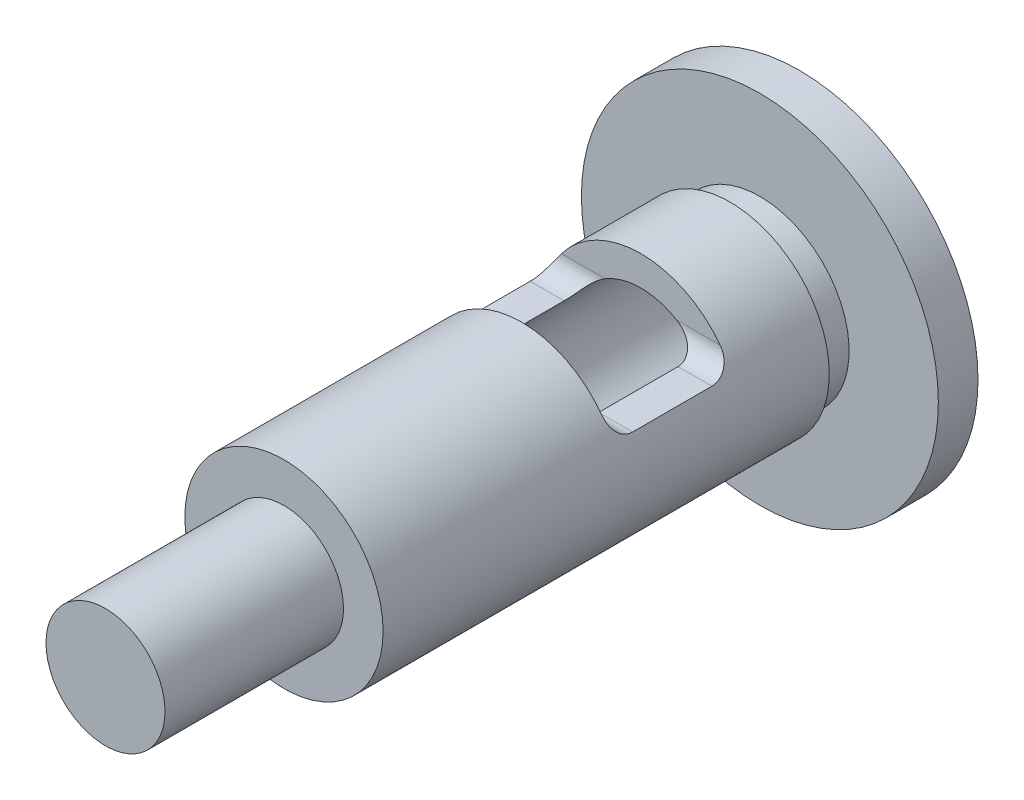
ISO-10303-21;
HEADER;
FILE_DESCRIPTION(('STEP AP214'),'2;1');
FILE_NAME('part.step','',(''),(''),'','','');
FILE_SCHEMA(('AUTOMOTIVE_DESIGN { 1 0 10303 214 1 1 1 1 }'));
ENDSEC;
DATA;
#1=APPLICATION_CONTEXT('core data for automotive mechanical design processes');
#2=APPLICATION_PROTOCOL_DEFINITION('international standard','automotive_design',2000,#1);
#3=PRODUCT_CONTEXT('',#1,'mechanical');
#4=PRODUCT('Part','Part','',(#3));
#5=PRODUCT_RELATED_PRODUCT_CATEGORY('part','',(#4));
#6=PRODUCT_DEFINITION_FORMATION('','',#4);
#7=PRODUCT_DEFINITION_CONTEXT('part definition',#1,'design');
#8=PRODUCT_DEFINITION('design','',#6,#7);
#9=PRODUCT_DEFINITION_SHAPE('','',#8);
#10=(LENGTH_UNIT() NAMED_UNIT(*) SI_UNIT(.MILLI.,.METRE.));
#11=(NAMED_UNIT(*) PLANE_ANGLE_UNIT() SI_UNIT($,.RADIAN.));
#12=(NAMED_UNIT(*) SI_UNIT($,.STERADIAN.) SOLID_ANGLE_UNIT());
#13=UNCERTAINTY_MEASURE_WITH_UNIT(LENGTH_MEASURE(1.E-05),#10,'distance_accuracy_value','');
#14=(GEOMETRIC_REPRESENTATION_CONTEXT(3) GLOBAL_UNCERTAINTY_ASSIGNED_CONTEXT((#13)) GLOBAL_UNIT_ASSIGNED_CONTEXT((#10,
#11,#12)) REPRESENTATION_CONTEXT('',''));
#15=CARTESIAN_POINT('',(0.,0.,0.));
#16=DIRECTION('',(0.,0.,1.));
#17=DIRECTION('',(1.,0.,0.));
#18=AXIS2_PLACEMENT_3D('',#15,#16,#17);
#19=CARTESIAN_POINT('',(0.,0.,0.));
#20=DIRECTION('',(0.,0.,-1.));
#21=DIRECTION('',(-1.,0.,0.));
#22=AXIS2_PLACEMENT_3D('',#19,#20,#21);
#23=CYLINDRICAL_SURFACE('',#22,10.);
#24=CARTESIAN_POINT('',(0.,0.,52.));
#25=DIRECTION('',(0.,0.,-1.));
#26=DIRECTION('',(-1.,0.,0.));
#27=AXIS2_PLACEMENT_3D('',#24,#25,#26);
#28=CIRCLE('',#27,10.);
#29=CARTESIAN_POINT('',(-10.,0.,52.));
#30=VERTEX_POINT('',#29);
#31=EDGE_CURVE('E249',#30,#30,#28,.T.);
#32=ORIENTED_EDGE('',*,*,#31,.T.);
#33=EDGE_LOOP('',(#32));
#34=FACE_BOUND('',#33,.T.);
#35=CARTESIAN_POINT('',(0.,0.,7.));
#36=DIRECTION('',(0.,0.,-1.));
#37=DIRECTION('',(-1.,0.,0.));
#38=AXIS2_PLACEMENT_3D('',#35,#36,#37);
#39=CIRCLE('',#38,10.);
#40=CARTESIAN_POINT('',(-10.,0.,7.));
#41=VERTEX_POINT('',#40);
#42=EDGE_CURVE('E254',#41,#41,#39,.T.);
#43=ORIENTED_EDGE('',*,*,#42,.F.);
#44=EDGE_LOOP('',(#43));
#45=FACE_BOUND('',#44,.T.);
#46=CARTESIAN_POINT('',(0.,0.,28.));
#47=DIRECTION('',(0.,0.,-1.));
#48=DIRECTION('',(-1.,0.,0.));
#49=AXIS2_PLACEMENT_3D('',#46,#47,#48);
#50=CIRCLE('',#49,10.);
#51=CARTESIAN_POINT('',(7.99999999999999,6.00000000000001,28.));
#52=VERTEX_POINT('',#51);
#53=CARTESIAN_POINT('',(-7.99999999999999,6.00000000000001,28.));
#54=VERTEX_POINT('',#53);
#55=EDGE_CURVE('E238',#52,#54,#50,.F.);
#56=ORIENTED_EDGE('',*,*,#55,.T.);
#57=CARTESIAN_POINT('',(-7.99999999999999,6.00000000000001,28.));
#58=CARTESIAN_POINT('',(-8.05100860734724,5.93200968711192,28.0000006017743));
#59=CARTESIAN_POINT('',(-8.10115365222653,5.8633227757035,27.9965312715209));
#60=CARTESIAN_POINT('',(-8.19942377317648,5.72508416287429,27.9822362732475));
#61=CARTESIAN_POINT('',(-8.24754486313818,5.65553107530453,27.9713967498904));
#62=CARTESIAN_POINT('',(-8.34147945854254,5.51605217330794,27.9418788272164));
#63=CARTESIAN_POINT('',(-8.38728221352921,5.44612603709733,27.9231670974573));
#64=CARTESIAN_POINT('',(-8.47590454553098,5.30714938590851,27.8775799116504));
#65=CARTESIAN_POINT('',(-8.51872679892919,5.23809813211877,27.8507118990157));
#66=CARTESIAN_POINT('',(-8.6187034931901,5.07255731362541,27.7751856070284));
#67=CARTESIAN_POINT('',(-8.67414266859352,4.97698045814653,27.7221231604303));
#68=CARTESIAN_POINT('',(-8.77699348164833,4.79327271198358,27.598754611255));
#69=CARTESIAN_POINT('',(-8.82442593485662,4.7051228217874,27.5284944227016));
#70=CARTESIAN_POINT('',(-8.91083720028691,4.53935888130144,27.371008855693));
#71=CARTESIAN_POINT('',(-8.94976464838187,4.46180985101524,27.2836861210925));
#72=CARTESIAN_POINT('',(-9.0182142913682,4.32179606710732,27.0942981292375));
#73=CARTESIAN_POINT('',(-9.04773146024579,4.25933937857461,26.9922250359942));
#74=CARTESIAN_POINT('',(-9.09466953671398,4.15810169516961,26.786931105403));
#75=CARTESIAN_POINT('',(-9.11297222672082,4.11763694664433,26.6847374467985));
#76=CARTESIAN_POINT('',(-9.14149760740605,4.05391926931878,26.4741492396114));
#77=CARTESIAN_POINT('',(-9.15173523125053,4.03063453533525,26.3657665516932));
#78=CARTESIAN_POINT('',(-9.16035163835097,4.01098253148704,26.2136724930338));
#79=CARTESIAN_POINT('',(-9.16215309604838,4.00686409758567,26.1710259909114));
#80=CARTESIAN_POINT('',(-9.16455116975046,4.0013760840502,26.0855935236979));
#81=CARTESIAN_POINT('',(-9.16514977186681,4.00000197311215,26.0428079055335));
#82=CARTESIAN_POINT('',(-9.16515138991168,4.,26.));
#83=B_SPLINE_CURVE_WITH_KNOTS('',3,(#57,#58,#59,#60,#61,#62,#63,#64,#65,#66,#67,#68,#69,#70,#71,
#72,#73,#74,#75,#76,#77,#78,#79,#80,#81,#82),.UNSPECIFIED.,.F.,.F.,(4,2,2,2,2,2,2,2,2,2,2,2,4),
(0.,0.254972115430075,0.51042488690115,0.766970291028312,1.02328227241889,1.38935419811024,
1.75445925631581,2.12171181168203,2.48916018866137,2.82175586610571,3.15373425696247,
3.28229982324812,3.41065293170572),.UNSPECIFIED.);
#84=CARTESIAN_POINT('',(-9.16515138991168,4.,26.));
#85=VERTEX_POINT('',#84);
#86=EDGE_CURVE('E191',#54,#85,#83,.T.);
#87=ORIENTED_EDGE('',*,*,#86,.T.);
#88=DIRECTION('',(0.,0.,-1.));
#89=VECTOR('',#88,1.);
#90=CARTESIAN_POINT('',(-9.16515138991168,4.,0.));
#91=LINE('',#90,#89);
#92=CARTESIAN_POINT('',(-9.16515138991168,4.,18.));
#93=VERTEX_POINT('',#92);
#94=EDGE_CURVE('E240',#85,#93,#91,.T.);
#95=ORIENTED_EDGE('',*,*,#94,.T.);
#96=CARTESIAN_POINT('',(-9.16515138991168,4.,18.));
#97=CARTESIAN_POINT('',(-9.16515117183312,3.99999264234156,17.9476691734351));
#98=CARTESIAN_POINT('',(-9.16425496664045,4.00205376138436,17.8953414927471));
#99=CARTESIAN_POINT('',(-9.16067005739489,4.01025694582917,17.7910758126955));
#100=CARTESIAN_POINT('',(-9.15798160024527,4.01639844911104,17.7391377606527));
#101=CARTESIAN_POINT('',(-9.15081977291224,4.03268797715261,17.636136744279));
#102=CARTESIAN_POINT('',(-9.14635045442331,4.04282690669225,17.5850720660826));
#103=CARTESIAN_POINT('',(-9.13563109883409,4.06699124711838,17.4840760640679));
#104=CARTESIAN_POINT('',(-9.12938105685553,4.0810166686519,17.4341447433549));
#105=CARTESIAN_POINT('',(-9.10795685357301,4.12872306426808,17.2865715998994));
#106=CARTESIAN_POINT('',(-9.09010262629202,4.16804823069825,17.1910631409174));
#107=CARTESIAN_POINT('',(-9.04734503409114,4.26005905139115,17.0084973511718));
#108=CARTESIAN_POINT('',(-9.0224400642028,4.31274774732447,16.9214419506537));
#109=CARTESIAN_POINT('',(-8.96516926076699,4.43058754304288,16.7560294596436));
#110=CARTESIAN_POINT('',(-8.93265886592638,4.49597530571395,16.6778912457653));
#111=CARTESIAN_POINT('',(-8.86085839472232,4.63587792882915,16.5339670559478));
#112=CARTESIAN_POINT('',(-8.82156905089418,4.7103918028507,16.4681797469683));
#113=CARTESIAN_POINT('',(-8.7337050665276,4.8714862628894,16.3454847069902));
#114=CARTESIAN_POINT('',(-8.68466859165629,4.95854821418175,16.2895421936174));
#115=CARTESIAN_POINT('',(-8.58017049651171,5.13725940054471,16.1927808080525));
#116=CARTESIAN_POINT('',(-8.52469686398252,5.22891702453962,16.1519908272592));
#117=CARTESIAN_POINT('',(-8.39548924689344,5.43447129881107,16.0778725937928));
#118=CARTESIAN_POINT('',(-8.32041851960717,5.54883725751874,16.0481419193314));
#119=CARTESIAN_POINT('',(-8.2032821451696,5.7193485046504,16.0189494574638));
#120=CARTESIAN_POINT('',(-8.16353999327878,5.77593472661013,16.0117852073056));
#121=CARTESIAN_POINT('',(-8.08272919797198,5.88848713541995,16.002316231558));
#122=CARTESIAN_POINT('',(-8.04166182979912,5.9444538526182,16.0000069677809));
#123=CARTESIAN_POINT('',(-7.99999999999999,6.00000000000001,16.));
#124=B_SPLINE_CURVE_WITH_KNOTS('',3,(#96,#97,#98,#99,#100,#101,#102,#103,#104,#105,#106,#107,
#108,#109,#110,#111,#112,#113,#114,#115,#116,#117,#118,#119,#120,#121,#122,#123),.UNSPECIFIED.,
.F.,.F.,(4,2,2,2,2,2,2,2,2,2,2,2,2,4),(0.,0.156938762205109,0.313855908760739,0.470418068100069,
0.62698065634509,0.939842867153021,1.25277635247853,1.57222617149183,1.89164149225455,
2.23379020068857,2.57658797718782,2.99455494394361,3.2029600514477,3.41117026596516),.UNSPECIFIED.);
#125=CARTESIAN_POINT('',(-7.99999999999999,6.00000000000001,16.));
#126=VERTEX_POINT('',#125);
#127=EDGE_CURVE('E162',#93,#126,#124,.T.);
#128=ORIENTED_EDGE('',*,*,#127,.T.);
#129=CARTESIAN_POINT('',(0.,0.,16.));
#130=DIRECTION('',(0.,0.,1.));
#131=DIRECTION('',(1.,0.,0.));
#132=AXIS2_PLACEMENT_3D('',#129,#130,#131);
#133=CIRCLE('',#132,10.);
#134=CARTESIAN_POINT('',(7.99999999999999,6.00000000000001,16.));
#135=VERTEX_POINT('',#134);
#136=EDGE_CURVE('E224',#126,#135,#133,.F.);
#137=ORIENTED_EDGE('',*,*,#136,.T.);
#138=CARTESIAN_POINT('',(7.99999999999999,6.00000000000001,16.));
#139=CARTESIAN_POINT('',(8.05100860734724,5.93200968711192,15.9999993982257));
#140=CARTESIAN_POINT('',(8.10115365222653,5.8633227757035,16.0034687284791));
#141=CARTESIAN_POINT('',(8.19942377317648,5.72508416287429,16.0177637267525));
#142=CARTESIAN_POINT('',(8.24754486313818,5.65553107530453,16.0286032501096));
#143=CARTESIAN_POINT('',(8.34147945854254,5.51605217330794,16.0581211727836));
#144=CARTESIAN_POINT('',(8.38728221352921,5.44612603709733,16.0768329025427));
#145=CARTESIAN_POINT('',(8.47590454553098,5.30714938590851,16.1224200883496));
#146=CARTESIAN_POINT('',(8.51872679892919,5.23809813211877,16.1492881009843));
#147=CARTESIAN_POINT('',(8.6187034931901,5.07255731362541,16.2248143929716));
#148=CARTESIAN_POINT('',(8.67414266859352,4.97698045814653,16.2778768395697));
#149=CARTESIAN_POINT('',(8.77699348164833,4.79327271198358,16.401245388745));
#150=CARTESIAN_POINT('',(8.82442593485662,4.7051228217874,16.4715055772984));
#151=CARTESIAN_POINT('',(8.91083720028691,4.53935888130144,16.628991144307));
#152=CARTESIAN_POINT('',(8.94976464838187,4.46180985101525,16.7163138789075));
#153=CARTESIAN_POINT('',(9.0182142913682,4.32179606710732,16.9057018707625));
#154=CARTESIAN_POINT('',(9.04773146024579,4.25933937857461,17.0077749640058));
#155=CARTESIAN_POINT('',(9.09466953671398,4.15810169516961,17.213068894597));
#156=CARTESIAN_POINT('',(9.11297222672082,4.11763694664432,17.3152625532015));
#157=CARTESIAN_POINT('',(9.14149760740605,4.05391926931878,17.5258507603886));
#158=CARTESIAN_POINT('',(9.15173523125053,4.03063453533525,17.6342334483068));
#159=CARTESIAN_POINT('',(9.16035163835097,4.01098253148704,17.7863275069662));
#160=CARTESIAN_POINT('',(9.16215309604838,4.00686409758567,17.8289740090886));
#161=CARTESIAN_POINT('',(9.16455116975046,4.0013760840502,17.9144064763021));
#162=CARTESIAN_POINT('',(9.16514977186681,4.00000197311215,17.9571920944665));
#163=CARTESIAN_POINT('',(9.16515138991168,4.,18.));
#164=B_SPLINE_CURVE_WITH_KNOTS('',3,(#138,#139,#140,#141,#142,#143,#144,#145,#146,#147,#148,
#149,#150,#151,#152,#153,#154,#155,#156,#157,#158,#159,#160,#161,#162,#163),.UNSPECIFIED.,.F.,
.F.,(4,2,2,2,2,2,2,2,2,2,2,2,4),(0.,0.254972115430075,0.51042488690115,0.766970291028312,
1.02328227241889,1.38935419811024,1.75445925631581,2.12171181168202,2.48916018866137,
2.82175586610572,3.15373425696247,3.28229982324812,3.41065293170572),.UNSPECIFIED.);
#165=CARTESIAN_POINT('',(9.16515138991168,4.,18.));
#166=VERTEX_POINT('',#165);
#167=EDGE_CURVE('E155',#135,#166,#164,.T.);
#168=ORIENTED_EDGE('',*,*,#167,.T.);
#169=DIRECTION('',(0.,0.,-1.));
#170=VECTOR('',#169,1.);
#171=CARTESIAN_POINT('',(9.16515138991168,4.,0.));
#172=LINE('',#171,#170);
#173=CARTESIAN_POINT('',(9.16515138991168,4.,26.));
#174=VERTEX_POINT('',#173);
#175=EDGE_CURVE('E121',#166,#174,#172,.F.);
#176=ORIENTED_EDGE('',*,*,#175,.T.);
#177=CARTESIAN_POINT('',(9.16515138991168,4.,26.));
#178=CARTESIAN_POINT('',(9.16515117183312,3.99999264234156,26.0523308265649));
#179=CARTESIAN_POINT('',(9.16425496664045,4.00205376138436,26.1046585072529));
#180=CARTESIAN_POINT('',(9.16067005739489,4.01025694582917,26.2089241873045));
#181=CARTESIAN_POINT('',(9.15798160024527,4.01639844911103,26.2608622393473));
#182=CARTESIAN_POINT('',(9.15081977291224,4.03268797715261,26.363863255721));
#183=CARTESIAN_POINT('',(9.14635045442331,4.04282690669225,26.4149279339174));
#184=CARTESIAN_POINT('',(9.1356310988341,4.06699124711838,26.5159239359321));
#185=CARTESIAN_POINT('',(9.12938105685553,4.0810166686519,26.5658552566451));
#186=CARTESIAN_POINT('',(9.10795685357301,4.12872306426808,26.7134284001006));
#187=CARTESIAN_POINT('',(9.09010262629202,4.16804823069825,26.8089368590826));
#188=CARTESIAN_POINT('',(9.04734503409114,4.26005905139115,26.9915026488282));
#189=CARTESIAN_POINT('',(9.0224400642028,4.31274774732447,27.0785580493463));
#190=CARTESIAN_POINT('',(8.96516926076699,4.43058754304288,27.2439705403564));
#191=CARTESIAN_POINT('',(8.93265886592638,4.49597530571395,27.3221087542347));
#192=CARTESIAN_POINT('',(8.86085839472232,4.63587792882915,27.4660329440522));
#193=CARTESIAN_POINT('',(8.82156905089418,4.7103918028507,27.5318202530317));
#194=CARTESIAN_POINT('',(8.7337050665276,4.8714862628894,27.6545152930098));
#195=CARTESIAN_POINT('',(8.68466859165629,4.95854821418175,27.7104578063826));
#196=CARTESIAN_POINT('',(8.58017049651171,5.13725940054471,27.8072191919475));
#197=CARTESIAN_POINT('',(8.52469686398252,5.22891702453962,27.8480091727408));
#198=CARTESIAN_POINT('',(8.39548924689344,5.43447129881107,27.9221274062072));
#199=CARTESIAN_POINT('',(8.32041851960717,5.54883725751874,27.9518580806686));
#200=CARTESIAN_POINT('',(8.2032821451696,5.7193485046504,27.9810505425362));
#201=CARTESIAN_POINT('',(8.16353999327878,5.77593472661013,27.9882147926944));
#202=CARTESIAN_POINT('',(8.08272919797198,5.88848713541995,27.997683768442));
#203=CARTESIAN_POINT('',(8.04166182979912,5.9444538526182,27.9999930322191));
#204=CARTESIAN_POINT('',(7.99999999999999,6.00000000000001,28.));
#205=B_SPLINE_CURVE_WITH_KNOTS('',3,(#177,#178,#179,#180,#181,#182,#183,#184,#185,#186,#187,
#188,#189,#190,#191,#192,#193,#194,#195,#196,#197,#198,#199,#200,#201,#202,#203,#204),
.UNSPECIFIED.,.F.,.F.,(4,2,2,2,2,2,2,2,2,2,2,2,2,4),(0.,0.156938762205106,0.313855908760735,
0.470418068100069,0.62698065634509,0.939842867153017,1.25277635247853,1.57222617149183,
1.89164149225455,2.23379020068857,2.57658797718782,2.99455494394361,3.2029600514477,
3.41117026596516),.UNSPECIFIED.);
#206=EDGE_CURVE('E184',#174,#52,#205,.T.);
#207=ORIENTED_EDGE('',*,*,#206,.T.);
#208=EDGE_LOOP('',(#56,#87,#95,#128,#137,#168,#176,#207));
#209=FACE_BOUND('',#208,.T.);
#210=ADVANCED_FACE('F33',(#34,#45,#209),#23,.T.);
#211=CARTESIAN_POINT('',(0.,0.,0.));
#212=DIRECTION('',(0.,0.,-1.));
#213=DIRECTION('',(-1.,0.,0.));
#214=AXIS2_PLACEMENT_3D('',#211,#212,#213);
#215=CYLINDRICAL_SURFACE('',#214,7.);
#216=CARTESIAN_POINT('',(0.,0.,0.));
#217=DIRECTION('',(0.,0.,-1.));
#218=DIRECTION('',(-1.,0.,0.));
#219=AXIS2_PLACEMENT_3D('',#216,#217,#218);
#220=CIRCLE('',#219,7.);
#221=CARTESIAN_POINT('',(-7.,0.,0.));
#222=VERTEX_POINT('',#221);
#223=EDGE_CURVE('E269',#222,#222,#220,.T.);
#224=ORIENTED_EDGE('',*,*,#223,.T.);
#225=EDGE_LOOP('',(#224));
#226=FACE_BOUND('',#225,.T.);
#227=CARTESIAN_POINT('',(0.,0.,32.));
#228=DIRECTION('',(0.,0.,-1.));
#229=DIRECTION('',(-1.,0.,0.));
#230=AXIS2_PLACEMENT_3D('',#227,#228,#229);
#231=CIRCLE('',#230,7.);
#232=CARTESIAN_POINT('',(-7.,0.,32.));
#233=VERTEX_POINT('',#232);
#234=EDGE_CURVE('E272',#233,#233,#231,.T.);
#235=ORIENTED_EDGE('',*,*,#234,.F.);
#236=EDGE_LOOP('',(#235));
#237=FACE_BOUND('',#236,.T.);
#238=CARTESIAN_POINT('',(0.,0.,28.));
#239=DIRECTION('',(0.,0.,-1.));
#240=DIRECTION('',(-1.,0.,0.));
#241=AXIS2_PLACEMENT_3D('',#238,#239,#240);
#242=CIRCLE('',#241,7.);
#243=CARTESIAN_POINT('',(-3.60555127546397,6.00000000000001,28.));
#244=VERTEX_POINT('',#243);
#245=CARTESIAN_POINT('',(3.60555127546397,6.00000000000001,28.));
#246=VERTEX_POINT('',#245);
#247=EDGE_CURVE('E215',#244,#246,#242,.T.);
#248=ORIENTED_EDGE('',*,*,#247,.T.);
#249=CARTESIAN_POINT('',(3.60555127546397,6.00000000000001,28.));
#250=CARTESIAN_POINT('',(3.70755190220597,5.93873299354331,27.9999691426322));
#251=CARTESIAN_POINT('',(3.8080513779399,5.87477355515046,27.9971788706329));
#252=CARTESIAN_POINT('',(4.00576923521182,5.74177528480111,27.984399412456));
#253=CARTESIAN_POINT('',(4.10297158250474,5.67271572056948,27.9743792060938));
#254=CARTESIAN_POINT('',(4.29414987915284,5.52944271837615,27.9452444235261));
#255=CARTESIAN_POINT('',(4.38806796688927,5.45517424905926,27.9260140962841));
#256=CARTESIAN_POINT('',(4.57011586626603,5.30358694827469,27.8765279801898));
#257=CARTESIAN_POINT('',(4.65825684964816,5.22627449658854,27.8462942594199));
#258=CARTESIAN_POINT('',(4.83398512361372,5.06437226026307,27.7700783510154));
#259=CARTESIAN_POINT('',(4.92104588946857,4.97966820381642,27.7230939442019));
#260=CARTESIAN_POINT('',(5.08498320917748,4.81213356476993,27.6121512784971));
#261=CARTESIAN_POINT('',(5.16189781072966,4.72929700828367,27.5482593003486));
#262=CARTESIAN_POINT('',(5.30469883781685,4.56857133575475,27.4010600725461));
#263=CARTESIAN_POINT('',(5.37043950048018,4.49075478431506,27.3175257829649));
#264=CARTESIAN_POINT('',(5.45813578256462,4.38302820321118,27.17850138587));
#265=CARTESIAN_POINT('',(5.48556279890794,4.3485999177601,27.1298372389949));
#266=CARTESIAN_POINT('',(5.53657238950481,4.28346448739372,27.0281733804973));
#267=CARTESIAN_POINT('',(5.56015592373645,4.25275641378256,26.9751747564696));
#268=CARTESIAN_POINT('',(5.60013211213682,4.19993526040025,26.8732524300319));
#269=CARTESIAN_POINT('',(5.61707160908512,4.17722155172676,26.8248524489374));
#270=CARTESIAN_POINT('',(5.64787993354286,4.13547155849595,26.7255564975638));
#271=CARTESIAN_POINT('',(5.66174936936746,4.11643454551777,26.6746610241979));
#272=CARTESIAN_POINT('',(5.6863169852022,4.08243062040585,26.5708806171931));
#273=CARTESIAN_POINT('',(5.69702022445897,4.0674572182494,26.5179990112638));
#274=CARTESIAN_POINT('',(5.71522127202601,4.04184263000406,26.4106841046948));
#275=CARTESIAN_POINT('',(5.72272079625583,4.03119912495515,26.356251651401));
#276=CARTESIAN_POINT('',(5.73391808908985,4.0152550913869,26.2516172389729));
#277=CARTESIAN_POINT('',(5.73791119956913,4.0095404415909,26.2015094593752));
#278=CARTESIAN_POINT('',(5.74323247250417,4.00191011564273,26.1009360982872));
#279=CARTESIAN_POINT('',(5.74456434639819,3.99998914875317,26.0504711137427));
#280=CARTESIAN_POINT('',(5.74456264653803,4.,26.));
#281=B_SPLINE_CURVE_WITH_KNOTS('',3,(#249,#250,#251,#252,#253,#254,#255,#256,#257,#258,#259,
#260,#261,#262,#263,#264,#265,#266,#267,#268,#269,#270,#271,#272,#273,#274,#275,#276,#277,#278,
#279,#280),.UNSPECIFIED.,.F.,.F.,(4,2,2,2,2,2,2,2,2,2,2,2,2,2,2,4),(0.,0.357039762700281,
0.715620591012604,1.07883121608528,1.4413173750221,1.83070447855544,2.2185871637635,
2.61119513860311,2.80775068768575,3.00425706803094,3.17226499785615,3.34023960800673,
3.50794434443645,3.67555914473391,3.82711916732992,3.97846767194919),.UNSPECIFIED.);
#282=CARTESIAN_POINT('',(5.74456264653803,4.,26.));
#283=VERTEX_POINT('',#282);
#284=EDGE_CURVE('E11',#246,#283,#281,.T.);
#285=ORIENTED_EDGE('',*,*,#284,.T.);
#286=DIRECTION('',(0.,0.,-1.));
#287=VECTOR('',#286,1.);
#288=CARTESIAN_POINT('',(5.74456264653803,4.,0.));
#289=LINE('',#288,#287);
#290=CARTESIAN_POINT('',(5.74456264653803,4.,18.));
#291=VERTEX_POINT('',#290);
#292=EDGE_CURVE('E47',#283,#291,#289,.T.);
#293=ORIENTED_EDGE('',*,*,#292,.T.);
#294=CARTESIAN_POINT('',(5.74456264653803,4.,18.));
#295=CARTESIAN_POINT('',(5.74456395739622,3.9999912690224,17.9521072018173));
#296=CARTESIAN_POINT('',(5.74336481366962,4.00172008399424,17.9042181933505));
#297=CARTESIAN_POINT('',(5.73857681057153,4.00858681048308,17.8088167769062));
#298=CARTESIAN_POINT('',(5.73498853238309,4.01372389290076,17.7613042801819));
#299=CARTESIAN_POINT('',(5.72545090585904,4.02731633277174,17.66717360582));
#300=CARTESIAN_POINT('',(5.71951023510699,4.03575949339295,17.6205527941813));
#301=CARTESIAN_POINT('',(5.70529577654531,4.05582920093227,17.5283766647713));
#302=CARTESIAN_POINT('',(5.69702193925205,4.06745581536741,17.4828213696204));
#303=CARTESIAN_POINT('',(5.66874757903505,4.10686714650466,17.3482705296767));
#304=CARTESIAN_POINT('',(5.64528172342668,4.13920172817476,17.2612663388019));
#305=CARTESIAN_POINT('',(5.58953490597338,4.21417455270277,17.0949163133744));
#306=CARTESIAN_POINT('',(5.55724989312686,4.25681752959233,17.0155740209715));
#307=CARTESIAN_POINT('',(5.48314916105369,4.35187528789755,16.863330727687));
#308=CARTESIAN_POINT('',(5.44103528724802,4.40458369493129,16.7907592212947));
#309=CARTESIAN_POINT('',(5.34882597720006,4.51611660865905,16.6562203333129));
#310=CARTESIAN_POINT('',(5.29872710476222,4.57494374463056,16.5942575409057));
#311=CARTESIAN_POINT('',(5.16947774158055,4.72117045758798,16.4578364756714));
#312=CARTESIAN_POINT('',(5.08683112566817,4.81040666125222,16.3886500077652));
#313=CARTESIAN_POINT('',(4.91008478408788,4.99069901803833,16.2699634531927));
#314=CARTESIAN_POINT('',(4.81596037985182,5.08175872791528,16.2205067982603));
#315=CARTESIAN_POINT('',(4.64678263995698,5.23608484037194,16.1502870282632));
#316=CARTESIAN_POINT('',(4.57389321774731,5.29990809898265,16.1253641327835));
#317=CARTESIAN_POINT('',(4.42420660418333,5.42549164241417,16.0831461624527));
#318=CARTESIAN_POINT('',(4.34740730827438,5.48725078592318,16.0658552451091));
#319=CARTESIAN_POINT('',(4.11207146301771,5.66832478707963,16.0237981156182));
#320=CARTESIAN_POINT('',(3.94850603225306,5.78351968974505,16.0088132102133));
#321=CARTESIAN_POINT('',(3.75149576891142,5.90994718935529,16.0019427559895));
#322=CARTESIAN_POINT('',(3.722460936441,5.92827738436944,16.0012044978374));
#323=CARTESIAN_POINT('',(3.66418008592678,5.96447395625101,16.0002335448968));
#324=CARTESIAN_POINT('',(3.63493464370731,5.98234123127445,15.9999997852162));
#325=CARTESIAN_POINT('',(3.60555127546397,6.00000000000001,16.));
#326=B_SPLINE_CURVE_WITH_KNOTS('',3,(#294,#295,#296,#297,#298,#299,#300,#301,#302,#303,#304,
#305,#306,#307,#308,#309,#310,#311,#312,#313,#314,#315,#316,#317,#318,#319,#320,#321,#322,#323,
#324,#325),.UNSPECIFIED.,.F.,.F.,(4,2,2,2,2,2,2,2,2,2,2,2,2,2,2,4),(0.,0.143625771782519,
0.287216617787313,0.430282643082833,0.573351702863238,0.859117671972935,1.1450151265141,
1.44108176204024,1.73727615004541,2.15474779837939,2.57313343256407,2.87283880763329,
3.17270724582121,3.77206419367062,3.87510243592871,3.97792297214895),.UNSPECIFIED.);
#327=CARTESIAN_POINT('',(3.60555127546397,6.00000000000001,16.));
#328=VERTEX_POINT('',#327);
#329=EDGE_CURVE('E107',#291,#328,#326,.T.);
#330=ORIENTED_EDGE('',*,*,#329,.T.);
#331=CARTESIAN_POINT('',(0.,0.,16.));
#332=DIRECTION('',(0.,0.,1.));
#333=DIRECTION('',(1.,0.,0.));
#334=AXIS2_PLACEMENT_3D('',#331,#332,#333);
#335=CIRCLE('',#334,7.);
#336=CARTESIAN_POINT('',(-3.60555127546397,6.00000000000001,16.));
#337=VERTEX_POINT('',#336);
#338=EDGE_CURVE('E114',#328,#337,#335,.T.);
#339=ORIENTED_EDGE('',*,*,#338,.T.);
#340=CARTESIAN_POINT('',(-3.60555127546397,6.00000000000001,16.));
#341=CARTESIAN_POINT('',(-3.70755190220597,5.93873299354331,16.0000308573678));
#342=CARTESIAN_POINT('',(-3.8080513779399,5.87477355515046,16.0028211293671));
#343=CARTESIAN_POINT('',(-4.00576923521182,5.74177528480111,16.015600587544));
#344=CARTESIAN_POINT('',(-4.10297158250474,5.67271572056948,16.0256207939062));
#345=CARTESIAN_POINT('',(-4.29414987915284,5.52944271837615,16.0547555764739));
#346=CARTESIAN_POINT('',(-4.38806796688927,5.45517424905926,16.0739859037159));
#347=CARTESIAN_POINT('',(-4.57011586626603,5.30358694827469,16.1234720198102));
#348=CARTESIAN_POINT('',(-4.65825684964816,5.22627449658854,16.1537057405801));
#349=CARTESIAN_POINT('',(-4.83398512361372,5.06437226026307,16.2299216489846));
#350=CARTESIAN_POINT('',(-4.92104588946857,4.97966820381642,16.2769060557981));
#351=CARTESIAN_POINT('',(-5.08498320917748,4.81213356476993,16.3878487215029));
#352=CARTESIAN_POINT('',(-5.16189781072966,4.72929700828367,16.4517406996515));
#353=CARTESIAN_POINT('',(-5.30469883781685,4.56857133575475,16.5989399274539));
#354=CARTESIAN_POINT('',(-5.37043950048018,4.49075478431506,16.6824742170351));
#355=CARTESIAN_POINT('',(-5.45813578256462,4.38302820321118,16.82149861413));
#356=CARTESIAN_POINT('',(-5.48556279890794,4.34859991776009,16.8701627610051));
#357=CARTESIAN_POINT('',(-5.53657238950481,4.28346448739372,16.9718266195027));
#358=CARTESIAN_POINT('',(-5.56015592373645,4.25275641378256,17.0248252435304));
#359=CARTESIAN_POINT('',(-5.60013211213683,4.19993526040025,17.1267475699681));
#360=CARTESIAN_POINT('',(-5.61707160908512,4.17722155172676,17.1751475510626));
#361=CARTESIAN_POINT('',(-5.64787993354286,4.13547155849595,17.2744435024362));
#362=CARTESIAN_POINT('',(-5.66174936936746,4.11643454551777,17.3253389758021));
#363=CARTESIAN_POINT('',(-5.6863169852022,4.08243062040585,17.4291193828069));
#364=CARTESIAN_POINT('',(-5.69702022445897,4.0674572182494,17.4820009887362));
#365=CARTESIAN_POINT('',(-5.71522127202601,4.04184263000406,17.5893158953052));
#366=CARTESIAN_POINT('',(-5.72272079625583,4.03119912495515,17.643748348599));
#367=CARTESIAN_POINT('',(-5.73391808908985,4.0152550913869,17.7483827610271));
#368=CARTESIAN_POINT('',(-5.73791119956913,4.0095404415909,17.7984905406248));
#369=CARTESIAN_POINT('',(-5.74323247250417,4.00191011564273,17.8990639017128));
#370=CARTESIAN_POINT('',(-5.74456434639819,3.99998914875317,17.9495288862573));
#371=CARTESIAN_POINT('',(-5.74456264653803,4.,18.));
#372=B_SPLINE_CURVE_WITH_KNOTS('',3,(#340,#341,#342,#343,#344,#345,#346,#347,#348,#349,#350,
#351,#352,#353,#354,#355,#356,#357,#358,#359,#360,#361,#362,#363,#364,#365,#366,#367,#368,#369,
#370,#371),.UNSPECIFIED.,.F.,.F.,(4,2,2,2,2,2,2,2,2,2,2,2,2,2,2,4),(0.,0.357039762700279,
0.715620591012603,1.07883121608528,1.4413173750221,1.83070447855545,2.2185871637635,
2.6111951386031,2.80775068768575,3.00425706803094,3.17226499785615,3.34023960800673,
3.50794434443644,3.67555914473391,3.82711916732992,3.97846767194919),.UNSPECIFIED.);
#373=CARTESIAN_POINT('',(-5.74456264653803,4.,18.));
#374=VERTEX_POINT('',#373);
#375=EDGE_CURVE('E145',#337,#374,#372,.T.);
#376=ORIENTED_EDGE('',*,*,#375,.T.);
#377=DIRECTION('',(0.,0.,-1.));
#378=VECTOR('',#377,1.);
#379=CARTESIAN_POINT('',(-5.74456264653803,4.,0.));
#380=LINE('',#379,#378);
#381=CARTESIAN_POINT('',(-5.74456264653803,4.,26.));
#382=VERTEX_POINT('',#381);
#383=EDGE_CURVE('E216',#374,#382,#380,.F.);
#384=ORIENTED_EDGE('',*,*,#383,.T.);
#385=CARTESIAN_POINT('',(-5.74456264653803,4.,26.));
#386=CARTESIAN_POINT('',(-5.74456395739623,3.9999912690224,26.0478927981827));
#387=CARTESIAN_POINT('',(-5.74336481366962,4.00172008399424,26.0957818066495));
#388=CARTESIAN_POINT('',(-5.73857681057153,4.00858681048308,26.1911832230938));
#389=CARTESIAN_POINT('',(-5.73498853238309,4.01372389290076,26.2386957198181));
#390=CARTESIAN_POINT('',(-5.72545090585904,4.02731633277174,26.33282639418));
#391=CARTESIAN_POINT('',(-5.71951023510699,4.03575949339296,26.3794472058187));
#392=CARTESIAN_POINT('',(-5.70529577654531,4.05582920093227,26.4716233352287));
#393=CARTESIAN_POINT('',(-5.69702193925205,4.06745581536741,26.5171786303796));
#394=CARTESIAN_POINT('',(-5.66874757903505,4.10686714650466,26.6517294703233));
#395=CARTESIAN_POINT('',(-5.64528172342668,4.13920172817476,26.7387336611981));
#396=CARTESIAN_POINT('',(-5.58953490597338,4.21417455270277,26.9050836866256));
#397=CARTESIAN_POINT('',(-5.55724989312686,4.25681752959233,26.9844259790285));
#398=CARTESIAN_POINT('',(-5.48314916105369,4.35187528789755,27.136669272313));
#399=CARTESIAN_POINT('',(-5.44103528724802,4.40458369493129,27.2092407787053));
#400=CARTESIAN_POINT('',(-5.34882597720006,4.51611660865905,27.3437796666871));
#401=CARTESIAN_POINT('',(-5.29872710476222,4.57494374463055,27.4057424590943));
#402=CARTESIAN_POINT('',(-5.16947774158055,4.72117045758798,27.5421635243286));
#403=CARTESIAN_POINT('',(-5.08683112566817,4.81040666125222,27.6113499922348));
#404=CARTESIAN_POINT('',(-4.91008478408789,4.99069901803833,27.7300365468073));
#405=CARTESIAN_POINT('',(-4.81596037985182,5.08175872791528,27.7794932017397));
#406=CARTESIAN_POINT('',(-4.64678263995698,5.23608484037194,27.8497129717368));
#407=CARTESIAN_POINT('',(-4.57389321774731,5.29990809898265,27.8746358672165));
#408=CARTESIAN_POINT('',(-4.42420660418333,5.42549164241417,27.9168538375474));
#409=CARTESIAN_POINT('',(-4.34740730827438,5.48725078592318,27.9341447548909));
#410=CARTESIAN_POINT('',(-4.11207146301771,5.66832478707963,27.9762018843818));
#411=CARTESIAN_POINT('',(-3.94850603225306,5.78351968974505,27.9911867897867));
#412=CARTESIAN_POINT('',(-3.75149576891142,5.90994718935529,27.9980572440105));
#413=CARTESIAN_POINT('',(-3.722460936441,5.92827738436944,27.9987955021626));
#414=CARTESIAN_POINT('',(-3.66418008592678,5.96447395625101,27.9997664551032));
#415=CARTESIAN_POINT('',(-3.63493464370731,5.98234123127445,28.0000002147838));
#416=CARTESIAN_POINT('',(-3.60555127546397,6.00000000000001,28.));
#417=B_SPLINE_CURVE_WITH_KNOTS('',3,(#385,#386,#387,#388,#389,#390,#391,#392,#393,#394,#395,
#396,#397,#398,#399,#400,#401,#402,#403,#404,#405,#406,#407,#408,#409,#410,#411,#412,#413,#414,
#415,#416),.UNSPECIFIED.,.F.,.F.,(4,2,2,2,2,2,2,2,2,2,2,2,2,2,2,4),(0.,0.143625771782515,
0.287216617787313,0.430282643082836,0.573351702863238,0.859117671972935,1.1450151265141,
1.44108176204023,1.73727615004541,2.15474779837939,2.57313343256407,2.87283880763329,
3.17270724582121,3.77206419367062,3.87510243592871,3.97792297214895),.UNSPECIFIED.);
#418=EDGE_CURVE('E208',#382,#244,#417,.T.);
#419=ORIENTED_EDGE('',*,*,#418,.T.);
#420=EDGE_LOOP('',(#248,#285,#293,#330,#339,#376,#384,#419));
#421=FACE_BOUND('',#420,.T.);
#422=ADVANCED_FACE('F126',(#226,#237,#421),#215,.F.);
#423=CARTESIAN_POINT('',(0.,0.,70.));
#424=DIRECTION('',(0.,0.,1.));
#425=DIRECTION('',(1.,0.,0.));
#426=AXIS2_PLACEMENT_3D('',#423,#424,#425);
#427=PLANE('',#426);
#428=CARTESIAN_POINT('',(0.,0.,70.));
#429=DIRECTION('',(0.,0.,-1.));
#430=DIRECTION('',(-1.,0.,0.));
#431=AXIS2_PLACEMENT_3D('',#428,#429,#430);
#432=CIRCLE('',#431,5.99999999999999);
#433=CARTESIAN_POINT('',(-5.99999999999999,0.,70.));
#434=VERTEX_POINT('',#433);
#435=EDGE_CURVE('E243',#434,#434,#432,.T.);
#436=ORIENTED_EDGE('',*,*,#435,.F.);
#437=EDGE_LOOP('',(#436));
#438=FACE_BOUND('',#437,.T.);
#439=ADVANCED_FACE('F35',(#438),#427,.T.);
#440=CARTESIAN_POINT('',(0.,0.,0.));
#441=DIRECTION('',(0.,0.,-1.));
#442=DIRECTION('',(-1.,0.,0.));
#443=AXIS2_PLACEMENT_3D('',#440,#441,#442);
#444=CYLINDRICAL_SURFACE('',#443,5.99999999999999);
#445=ORIENTED_EDGE('',*,*,#435,.T.);
#446=EDGE_LOOP('',(#445));
#447=FACE_BOUND('',#446,.T.);
#448=CARTESIAN_POINT('',(0.,0.,52.));
#449=DIRECTION('',(0.,0.,-1.));
#450=DIRECTION('',(-1.,0.,0.));
#451=AXIS2_PLACEMENT_3D('',#448,#449,#450);
#452=CIRCLE('',#451,5.99999999999999);
#453=CARTESIAN_POINT('',(-5.99999999999999,0.,52.));
#454=VERTEX_POINT('',#453);
#455=EDGE_CURVE('E245',#454,#454,#452,.T.);
#456=ORIENTED_EDGE('',*,*,#455,.F.);
#457=EDGE_LOOP('',(#456));
#458=FACE_BOUND('',#457,.T.);
#459=ADVANCED_FACE('F285',(#447,#458),#444,.T.);
#460=CARTESIAN_POINT('',(0.,5.99999999999999,52.));
#461=DIRECTION('',(0.,0.,1.));
#462=DIRECTION('',(1.,0.,0.));
#463=AXIS2_PLACEMENT_3D('',#460,#461,#462);
#464=PLANE('',#463);
#465=ORIENTED_EDGE('',*,*,#455,.T.);
#466=EDGE_LOOP('',(#465));
#467=FACE_BOUND('',#466,.T.);
#468=ORIENTED_EDGE('',*,*,#31,.F.);
#469=EDGE_LOOP('',(#468));
#470=FACE_BOUND('',#469,.T.);
#471=ADVANCED_FACE('F178',(#467,#470),#464,.T.);
#472=CARTESIAN_POINT('',(0.,10.,7.));
#473=DIRECTION('',(0.,0.,-1.));
#474=DIRECTION('',(-1.,0.,0.));
#475=AXIS2_PLACEMENT_3D('',#472,#473,#474);
#476=PLANE('',#475);
#477=ORIENTED_EDGE('',*,*,#42,.T.);
#478=EDGE_LOOP('',(#477));
#479=FACE_BOUND('',#478,.T.);
#480=CARTESIAN_POINT('',(0.,0.,7.));
#481=DIRECTION('',(0.,0.,-1.));
#482=DIRECTION('',(-1.,0.,0.));
#483=AXIS2_PLACEMENT_3D('',#480,#481,#482);
#484=CIRCLE('',#483,9.);
#485=CARTESIAN_POINT('',(-9.,0.,7.));
#486=VERTEX_POINT('',#485);
#487=EDGE_CURVE('E257',#486,#486,#484,.T.);
#488=ORIENTED_EDGE('',*,*,#487,.F.);
#489=EDGE_LOOP('',(#488));
#490=FACE_BOUND('',#489,.T.);
#491=ADVANCED_FACE('F176',(#479,#490),#476,.T.);
#492=CARTESIAN_POINT('',(0.,0.,0.));
#493=DIRECTION('',(0.,0.,-1.));
#494=DIRECTION('',(-1.,0.,0.));
#495=AXIS2_PLACEMENT_3D('',#492,#493,#494);
#496=CYLINDRICAL_SURFACE('',#495,9.);
#497=ORIENTED_EDGE('',*,*,#487,.T.);
#498=EDGE_LOOP('',(#497));
#499=FACE_BOUND('',#498,.T.);
#500=CARTESIAN_POINT('',(0.,0.,4.));
#501=DIRECTION('',(0.,0.,-1.));
#502=DIRECTION('',(-1.,0.,0.));
#503=AXIS2_PLACEMENT_3D('',#500,#501,#502);
#504=CIRCLE('',#503,9.);
#505=CARTESIAN_POINT('',(-9.,0.,4.));
#506=VERTEX_POINT('',#505);
#507=EDGE_CURVE('E260',#506,#506,#504,.T.);
#508=ORIENTED_EDGE('',*,*,#507,.F.);
#509=EDGE_LOOP('',(#508));
#510=FACE_BOUND('',#509,.T.);
#511=ADVANCED_FACE('F302',(#499,#510),#496,.T.);
#512=CARTESIAN_POINT('',(0.,18.,4.));
#513=DIRECTION('',(0.,0.,1.));
#514=DIRECTION('',(1.,0.,0.));
#515=AXIS2_PLACEMENT_3D('',#512,#513,#514);
#516=PLANE('',#515);
#517=ORIENTED_EDGE('',*,*,#507,.T.);
#518=EDGE_LOOP('',(#517));
#519=FACE_BOUND('',#518,.T.);
#520=CARTESIAN_POINT('',(0.,0.,4.));
#521=DIRECTION('',(0.,0.,-1.));
#522=DIRECTION('',(-1.,0.,0.));
#523=AXIS2_PLACEMENT_3D('',#520,#521,#522);
#524=CIRCLE('',#523,18.);
#525=CARTESIAN_POINT('',(-18.,0.,4.));
#526=VERTEX_POINT('',#525);
#527=EDGE_CURVE('E263',#526,#526,#524,.T.);
#528=ORIENTED_EDGE('',*,*,#527,.F.);
#529=EDGE_LOOP('',(#528));
#530=FACE_BOUND('',#529,.T.);
#531=ADVANCED_FACE('F297',(#519,#530),#516,.T.);
#532=CARTESIAN_POINT('',(0.,0.,0.));
#533=DIRECTION('',(0.,0.,-1.));
#534=DIRECTION('',(-1.,0.,0.));
#535=AXIS2_PLACEMENT_3D('',#532,#533,#534);
#536=CYLINDRICAL_SURFACE('',#535,18.);
#537=ORIENTED_EDGE('',*,*,#527,.T.);
#538=EDGE_LOOP('',(#537));
#539=FACE_BOUND('',#538,.T.);
#540=CARTESIAN_POINT('',(0.,0.,0.));
#541=DIRECTION('',(0.,0.,-1.));
#542=DIRECTION('',(-1.,0.,0.));
#543=AXIS2_PLACEMENT_3D('',#540,#541,#542);
#544=CIRCLE('',#543,18.);
#545=CARTESIAN_POINT('',(-18.,0.,0.));
#546=VERTEX_POINT('',#545);
#547=EDGE_CURVE('E266',#546,#546,#544,.T.);
#548=ORIENTED_EDGE('',*,*,#547,.F.);
#549=EDGE_LOOP('',(#548));
#550=FACE_BOUND('',#549,.T.);
#551=ADVANCED_FACE('F291',(#539,#550),#536,.T.);
#552=CARTESIAN_POINT('',(0.,18.,0.));
#553=DIRECTION('',(0.,0.,-1.));
#554=DIRECTION('',(-1.,0.,0.));
#555=AXIS2_PLACEMENT_3D('',#552,#553,#554);
#556=PLANE('',#555);
#557=ORIENTED_EDGE('',*,*,#547,.T.);
#558=EDGE_LOOP('',(#557));
#559=FACE_BOUND('',#558,.T.);
#560=ORIENTED_EDGE('',*,*,#223,.F.);
#561=EDGE_LOOP('',(#560));
#562=FACE_BOUND('',#561,.T.);
#563=ADVANCED_FACE('F289',(#559,#562),#556,.T.);
#564=CARTESIAN_POINT('',(0.,0.,36.));
#565=DIRECTION('',(0.,0.,-1.));
#566=DIRECTION('',(-1.,0.,0.));
#567=AXIS2_PLACEMENT_3D('',#564,#565,#566);
#568=CONICAL_SURFACE('',#567,0.,1.05165021254837);
#569=ORIENTED_EDGE('',*,*,#234,.T.);
#570=EDGE_LOOP('',(#569));
#571=FACE_BOUND('',#570,.T.);
#572=CARTESIAN_POINT('',(0.,0.,36.));
#573=VERTEX_POINT('',#572);
#574=VERTEX_LOOP('',#573);
#575=FACE_BOUND('',#574,.T.);
#576=ADVANCED_FACE('F277',(#571,#575),#568,.F.);
#577=CARTESIAN_POINT('',(10.,6.,26.));
#578=DIRECTION('',(-1.,0.,0.));
#579=DIRECTION('',(0.,0.,1.));
#580=AXIS2_PLACEMENT_3D('',#577,#578,#579);
#581=CYLINDRICAL_SURFACE('',#580,2.);
#582=DIRECTION('',(-1.,0.,0.));
#583=VECTOR('',#582,1.);
#584=CARTESIAN_POINT('',(10.,4.,26.));
#585=LINE('',#584,#583);
#586=EDGE_CURVE('E228',#174,#283,#585,.T.);
#587=ORIENTED_EDGE('',*,*,#586,.T.);
#588=ORIENTED_EDGE('',*,*,#284,.F.);
#589=DIRECTION('',(-1.,0.,0.));
#590=VECTOR('',#589,1.);
#591=CARTESIAN_POINT('',(10.,6.00000000000001,28.));
#592=LINE('',#591,#590);
#593=EDGE_CURVE('E163',#52,#246,#592,.T.);
#594=ORIENTED_EDGE('',*,*,#593,.F.);
#595=ORIENTED_EDGE('',*,*,#206,.F.);
#596=EDGE_LOOP('',(#587,#588,#594,#595));
#597=FACE_BOUND('',#596,.T.);
#598=ADVANCED_FACE('F203',(#597),#581,.F.);
#599=CARTESIAN_POINT('',(10.,4.,26.));
#600=DIRECTION('',(0.,1.,0.));
#601=DIRECTION('',(0.,0.,1.));
#602=AXIS2_PLACEMENT_3D('',#599,#600,#601);
#603=PLANE('',#602);
#604=DIRECTION('',(-1.,0.,0.));
#605=VECTOR('',#604,1.);
#606=CARTESIAN_POINT('',(10.,4.,18.));
#607=LINE('',#606,#605);
#608=EDGE_CURVE('E54',#166,#291,#607,.T.);
#609=ORIENTED_EDGE('',*,*,#608,.T.);
#610=ORIENTED_EDGE('',*,*,#292,.F.);
#611=ORIENTED_EDGE('',*,*,#586,.F.);
#612=ORIENTED_EDGE('',*,*,#175,.F.);
#613=EDGE_LOOP('',(#609,#610,#611,#612));
#614=FACE_BOUND('',#613,.T.);
#615=ADVANCED_FACE('F117',(#614),#603,.T.);
#616=CARTESIAN_POINT('',(10.,6.,18.));
#617=DIRECTION('',(-1.,0.,0.));
#618=DIRECTION('',(0.,0.,1.));
#619=AXIS2_PLACEMENT_3D('',#616,#617,#618);
#620=CYLINDRICAL_SURFACE('',#619,2.);
#621=DIRECTION('',(-1.,0.,0.));
#622=VECTOR('',#621,1.);
#623=CARTESIAN_POINT('',(10.,6.00000000000001,16.));
#624=LINE('',#623,#622);
#625=EDGE_CURVE('E110',#135,#328,#624,.T.);
#626=ORIENTED_EDGE('',*,*,#625,.T.);
#627=ORIENTED_EDGE('',*,*,#329,.F.);
#628=ORIENTED_EDGE('',*,*,#608,.F.);
#629=ORIENTED_EDGE('',*,*,#167,.F.);
#630=EDGE_LOOP('',(#626,#627,#628,#629));
#631=FACE_BOUND('',#630,.T.);
#632=ADVANCED_FACE('F108',(#631),#620,.F.);
#633=CARTESIAN_POINT('',(10.,6.00000000000001,16.));
#634=DIRECTION('',(0.,0.,1.));
#635=DIRECTION('',(1.,0.,0.));
#636=AXIS2_PLACEMENT_3D('',#633,#634,#635);
#637=PLANE('',#636);
#638=EDGE_CURVE('E223',#337,#126,#624,.T.);
#639=ORIENTED_EDGE('',*,*,#638,.F.);
#640=ORIENTED_EDGE('',*,*,#338,.F.);
#641=ORIENTED_EDGE('',*,*,#625,.F.);
#642=ORIENTED_EDGE('',*,*,#136,.F.);
#643=EDGE_LOOP('',(#639,#640,#641,#642));
#644=FACE_BOUND('',#643,.T.);
#645=ADVANCED_FACE('F221',(#644),#637,.T.);
#646=CARTESIAN_POINT('',(10.,10.,28.));
#647=DIRECTION('',(0.,0.,-1.));
#648=DIRECTION('',(-1.,0.,0.));
#649=AXIS2_PLACEMENT_3D('',#646,#647,#648);
#650=PLANE('',#649);
#651=ORIENTED_EDGE('',*,*,#593,.T.);
#652=ORIENTED_EDGE('',*,*,#247,.F.);
#653=EDGE_CURVE('E164',#244,#54,#592,.T.);
#654=ORIENTED_EDGE('',*,*,#653,.T.);
#655=ORIENTED_EDGE('',*,*,#55,.F.);
#656=EDGE_LOOP('',(#651,#652,#654,#655));
#657=FACE_BOUND('',#656,.T.);
#658=ADVANCED_FACE('F201',(#657),#650,.T.);
#659=ORIENTED_EDGE('',*,*,#653,.F.);
#660=ORIENTED_EDGE('',*,*,#418,.F.);
#661=EDGE_CURVE('E123',#382,#85,#585,.T.);
#662=ORIENTED_EDGE('',*,*,#661,.T.);
#663=ORIENTED_EDGE('',*,*,#86,.F.);
#664=EDGE_LOOP('',(#659,#660,#662,#663));
#665=FACE_BOUND('',#664,.T.);
#666=ADVANCED_FACE('F197',(#665),#581,.F.);
#667=ORIENTED_EDGE('',*,*,#661,.F.);
#668=ORIENTED_EDGE('',*,*,#383,.F.);
#669=EDGE_CURVE('E62',#374,#93,#607,.T.);
#670=ORIENTED_EDGE('',*,*,#669,.T.);
#671=ORIENTED_EDGE('',*,*,#94,.F.);
#672=EDGE_LOOP('',(#667,#668,#670,#671));
#673=FACE_BOUND('',#672,.T.);
#674=ADVANCED_FACE('F141',(#673),#603,.T.);
#675=ORIENTED_EDGE('',*,*,#669,.F.);
#676=ORIENTED_EDGE('',*,*,#375,.F.);
#677=ORIENTED_EDGE('',*,*,#638,.T.);
#678=ORIENTED_EDGE('',*,*,#127,.F.);
#679=EDGE_LOOP('',(#675,#676,#677,#678));
#680=FACE_BOUND('',#679,.T.);
#681=ADVANCED_FACE('F137',(#680),#620,.F.);
#682=CLOSED_SHELL('',(#210,#422,#439,#459,#471,#491,#511,#531,#551,#563,#576,#598,#615,#632,
#645,#658,#666,#674,#681));
#683=MANIFOLD_SOLID_BREP('B2',#682);
#684=ADVANCED_BREP_SHAPE_REPRESENTATION('',(#18,#683),#14);
#685=SHAPE_DEFINITION_REPRESENTATION(#9,#684);
ENDSEC;
END-ISO-10303-21;
